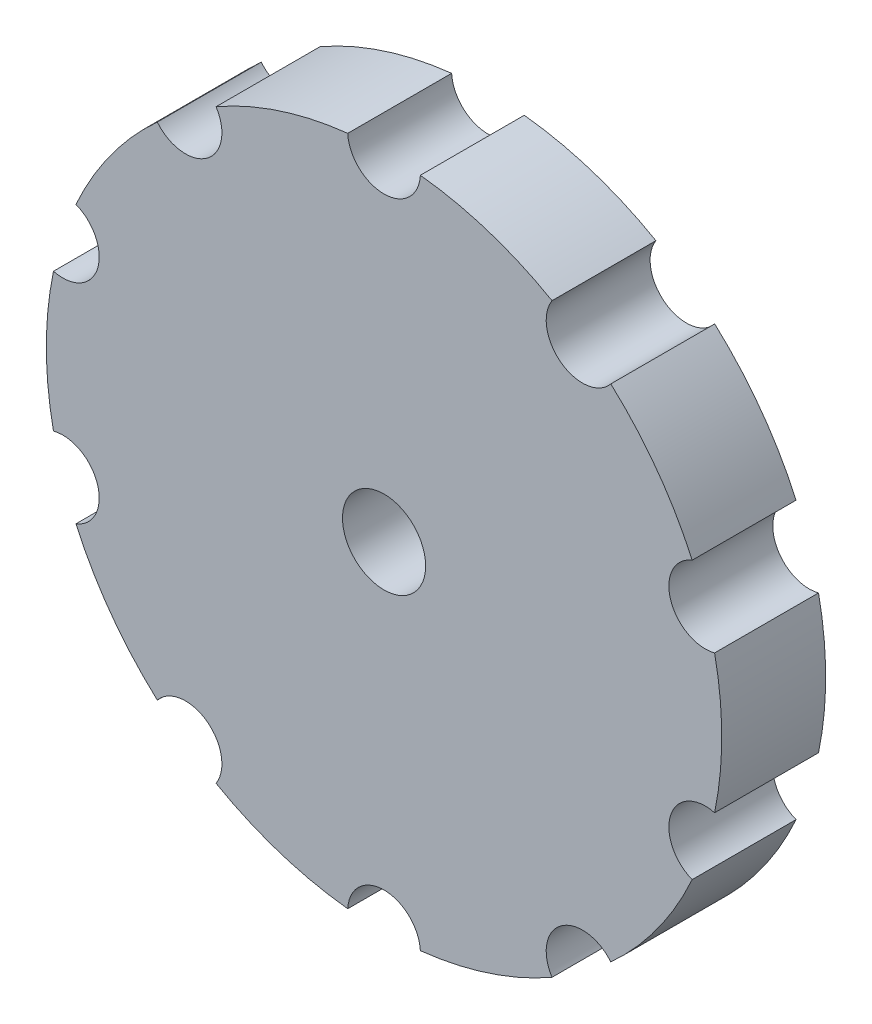
ISO-10303-21;
HEADER;
FILE_DESCRIPTION(('STEP AP214'),'2;1');
FILE_NAME('part.step','',(''),(''),'','','');
FILE_SCHEMA(('AUTOMOTIVE_DESIGN { 1 0 10303 214 1 1 1 1 }'));
ENDSEC;
DATA;
#1=APPLICATION_CONTEXT('core data for automotive mechanical design processes');
#2=APPLICATION_PROTOCOL_DEFINITION('international standard','automotive_design',2000,#1);
#3=PRODUCT_CONTEXT('',#1,'mechanical');
#4=PRODUCT('Part','Part','',(#3));
#5=PRODUCT_RELATED_PRODUCT_CATEGORY('part','',(#4));
#6=PRODUCT_DEFINITION_FORMATION('','',#4);
#7=PRODUCT_DEFINITION_CONTEXT('part definition',#1,'design');
#8=PRODUCT_DEFINITION('design','',#6,#7);
#9=PRODUCT_DEFINITION_SHAPE('','',#8);
#10=(LENGTH_UNIT() NAMED_UNIT(*) SI_UNIT(.MILLI.,.METRE.));
#11=(NAMED_UNIT(*) PLANE_ANGLE_UNIT() SI_UNIT($,.RADIAN.));
#12=(NAMED_UNIT(*) SI_UNIT($,.STERADIAN.) SOLID_ANGLE_UNIT());
#13=UNCERTAINTY_MEASURE_WITH_UNIT(LENGTH_MEASURE(1.E-05),#10,'distance_accuracy_value','');
#14=(GEOMETRIC_REPRESENTATION_CONTEXT(3) GLOBAL_UNCERTAINTY_ASSIGNED_CONTEXT((#13)) GLOBAL_UNIT_ASSIGNED_CONTEXT((#10,
#11,#12)) REPRESENTATION_CONTEXT('',''));
#15=CARTESIAN_POINT('',(0.,0.,0.));
#16=DIRECTION('',(0.,0.,1.));
#17=DIRECTION('',(1.,0.,0.));
#18=AXIS2_PLACEMENT_3D('',#15,#16,#17);
#19=CARTESIAN_POINT('',(-30.9093367795925,-10.0430523171858,10.));
#20=DIRECTION('',(0.,0.,-1.));
#21=DIRECTION('',(-1.,0.,0.));
#22=AXIS2_PLACEMENT_3D('',#19,#20,#21);
#23=CYLINDRICAL_SURFACE('',#22,3.5);
#24=CARTESIAN_POINT('',(-30.9093367795925,-10.0430523171858,0.));
#25=DIRECTION('',(0.,0.,1.));
#26=DIRECTION('',(1.,0.,0.));
#27=AXIS2_PLACEMENT_3D('',#24,#25,#26);
#28=CIRCLE('',#27,3.5);
#29=CARTESIAN_POINT('',(-29.6501088044898,-13.308683176104,0.));
#30=VERTEX_POINT('',#29);
#31=CARTESIAN_POINT('',(-31.8100896062454,-6.66094582192624,0.));
#32=VERTEX_POINT('',#31);
#33=EDGE_CURVE('E202',#30,#32,#28,.T.);
#34=ORIENTED_EDGE('',*,*,#33,.F.);
#35=DIRECTION('',(0.,0.,-1.));
#36=VECTOR('',#35,1.);
#37=CARTESIAN_POINT('',(-29.6501088044898,-13.308683176104,10.));
#38=LINE('',#37,#36);
#39=CARTESIAN_POINT('',(-29.6501088044898,-13.308683176104,10.));
#40=VERTEX_POINT('',#39);
#41=EDGE_CURVE('E11',#40,#30,#38,.T.);
#42=ORIENTED_EDGE('',*,*,#41,.F.);
#43=CARTESIAN_POINT('',(-30.9093367795925,-10.0430523171858,10.));
#44=DIRECTION('',(0.,0.,1.));
#45=DIRECTION('',(1.,0.,0.));
#46=AXIS2_PLACEMENT_3D('',#43,#44,#45);
#47=CIRCLE('',#46,3.5);
#48=CARTESIAN_POINT('',(-31.8100896062454,-6.66094582192624,10.));
#49=VERTEX_POINT('',#48);
#50=EDGE_CURVE('E315',#40,#49,#47,.T.);
#51=ORIENTED_EDGE('',*,*,#50,.T.);
#52=DIRECTION('',(0.,0.,-1.));
#53=VECTOR('',#52,1.);
#54=CARTESIAN_POINT('',(-31.8100896062454,-6.66094582192624,10.));
#55=LINE('',#54,#53);
#56=EDGE_CURVE('E120',#49,#32,#55,.T.);
#57=ORIENTED_EDGE('',*,*,#56,.T.);
#58=EDGE_LOOP('',(#34,#42,#51,#57));
#59=FACE_BOUND('',#58,.T.);
#60=ADVANCED_FACE('F33',(#59),#23,.F.);
#61=CARTESIAN_POINT('',(0.,0.,10.));
#62=DIRECTION('',(0.,0.,-1.));
#63=DIRECTION('',(-1.,0.,0.));
#64=AXIS2_PLACEMENT_3D('',#61,#62,#63);
#65=CYLINDRICAL_SURFACE('',#64,32.5);
#66=CARTESIAN_POINT('',(0.,0.,0.));
#67=DIRECTION('',(0.,0.,1.));
#68=DIRECTION('',(1.,0.,0.));
#69=AXIS2_PLACEMENT_3D('',#66,#67,#68);
#70=CIRCLE('',#69,32.5);
#71=CARTESIAN_POINT('',(-21.819697363595,-24.0863199132023,0.));
#72=VERTEX_POINT('',#71);
#73=EDGE_CURVE('E205',#30,#72,#70,.T.);
#74=ORIENTED_EDGE('',*,*,#73,.T.);
#75=DIRECTION('',(0.,0.,-1.));
#76=VECTOR('',#75,1.);
#77=CARTESIAN_POINT('',(-21.819697363595,-24.0863199132023,10.));
#78=LINE('',#77,#76);
#79=CARTESIAN_POINT('',(-21.819697363595,-24.0863199132023,10.));
#80=VERTEX_POINT('',#79);
#81=EDGE_CURVE('E42',#80,#72,#78,.T.);
#82=ORIENTED_EDGE('',*,*,#81,.F.);
#83=CARTESIAN_POINT('',(0.,0.,10.));
#84=DIRECTION('',(0.,0.,1.));
#85=DIRECTION('',(1.,0.,0.));
#86=AXIS2_PLACEMENT_3D('',#83,#84,#85);
#87=CIRCLE('',#86,32.5);
#88=EDGE_CURVE('E313',#40,#80,#87,.T.);
#89=ORIENTED_EDGE('',*,*,#88,.F.);
#90=ORIENTED_EDGE('',*,*,#41,.T.);
#91=EDGE_LOOP('',(#74,#82,#89,#90));
#92=FACE_BOUND('',#91,.T.);
#93=ADVANCED_FACE('F298',(#92),#65,.T.);
#94=CARTESIAN_POINT('',(-19.1030206995054,-26.2930523171858,10.));
#95=DIRECTION('',(0.,0.,-1.));
#96=DIRECTION('',(-1.,0.,0.));
#97=AXIS2_PLACEMENT_3D('',#94,#95,#96);
#98=CYLINDRICAL_SURFACE('',#97,3.5);
#99=CARTESIAN_POINT('',(-19.1030206995054,-26.2930523171858,0.));
#100=DIRECTION('',(0.,0.,1.));
#101=DIRECTION('',(1.,0.,0.));
#102=AXIS2_PLACEMENT_3D('',#99,#100,#101);
#103=CIRCLE('',#102,3.5);
#104=CARTESIAN_POINT('',(-16.1647942095517,-28.1948475463664,0.));
#105=VERTEX_POINT('',#104);
#106=EDGE_CURVE('E208',#105,#72,#103,.T.);
#107=ORIENTED_EDGE('',*,*,#106,.F.);
#108=DIRECTION('',(0.,0.,-1.));
#109=VECTOR('',#108,1.);
#110=CARTESIAN_POINT('',(-16.1647942095517,-28.1948475463664,10.));
#111=LINE('',#110,#109);
#112=CARTESIAN_POINT('',(-16.1647942095517,-28.1948475463664,10.));
#113=VERTEX_POINT('',#112);
#114=EDGE_CURVE('E288',#113,#105,#111,.T.);
#115=ORIENTED_EDGE('',*,*,#114,.F.);
#116=CARTESIAN_POINT('',(-19.1030206995054,-26.2930523171858,10.));
#117=DIRECTION('',(0.,0.,1.));
#118=DIRECTION('',(1.,0.,0.));
#119=AXIS2_PLACEMENT_3D('',#116,#117,#118);
#120=CIRCLE('',#119,3.5);
#121=EDGE_CURVE('E295',#113,#80,#120,.T.);
#122=ORIENTED_EDGE('',*,*,#121,.T.);
#123=ORIENTED_EDGE('',*,*,#81,.T.);
#124=EDGE_LOOP('',(#107,#115,#122,#123));
#125=FACE_BOUND('',#124,.T.);
#126=ADVANCED_FACE('F293',(#125),#98,.F.);
#127=CARTESIAN_POINT('',(0.,0.,10.));
#128=DIRECTION('',(0.,0.,-1.));
#129=DIRECTION('',(-1.,0.,0.));
#130=AXIS2_PLACEMENT_3D('',#127,#128,#129);
#131=CYLINDRICAL_SURFACE('',#130,32.5);
#132=CARTESIAN_POINT('',(0.,0.,0.));
#133=DIRECTION('',(0.,0.,1.));
#134=DIRECTION('',(1.,0.,0.));
#135=AXIS2_PLACEMENT_3D('',#132,#133,#134);
#136=CIRCLE('',#135,32.5);
#137=CARTESIAN_POINT('',(-3.49492235228777,-32.3115384615385,0.));
#138=VERTEX_POINT('',#137);
#139=EDGE_CURVE('E211',#105,#138,#136,.T.);
#140=ORIENTED_EDGE('',*,*,#139,.T.);
#141=DIRECTION('',(0.,0.,-1.));
#142=VECTOR('',#141,1.);
#143=CARTESIAN_POINT('',(-3.49492235228777,-32.3115384615385,10.));
#144=LINE('',#143,#142);
#145=CARTESIAN_POINT('',(-3.49492235228777,-32.3115384615385,10.));
#146=VERTEX_POINT('',#145);
#147=EDGE_CURVE('E286',#146,#138,#144,.T.);
#148=ORIENTED_EDGE('',*,*,#147,.F.);
#149=CARTESIAN_POINT('',(0.,0.,10.));
#150=DIRECTION('',(0.,0.,1.));
#151=DIRECTION('',(1.,0.,0.));
#152=AXIS2_PLACEMENT_3D('',#149,#150,#151);
#153=CIRCLE('',#152,32.5);
#154=EDGE_CURVE('E309',#113,#146,#153,.T.);
#155=ORIENTED_EDGE('',*,*,#154,.F.);
#156=ORIENTED_EDGE('',*,*,#114,.T.);
#157=EDGE_LOOP('',(#140,#148,#155,#156));
#158=FACE_BOUND('',#157,.T.);
#159=ADVANCED_FACE('F306',(#158),#131,.T.);
#160=CARTESIAN_POINT('',(0.,-32.5,10.));
#161=DIRECTION('',(0.,0.,-1.));
#162=DIRECTION('',(-1.,0.,0.));
#163=AXIS2_PLACEMENT_3D('',#160,#161,#162);
#164=CYLINDRICAL_SURFACE('',#163,3.5);
#165=CARTESIAN_POINT('',(0.,-32.5,0.));
#166=DIRECTION('',(0.,0.,1.));
#167=DIRECTION('',(1.,0.,0.));
#168=AXIS2_PLACEMENT_3D('',#165,#166,#167);
#169=CIRCLE('',#168,3.5);
#170=CARTESIAN_POINT('',(3.49492235228778,-32.3115384615385,0.));
#171=VERTEX_POINT('',#170);
#172=EDGE_CURVE('E214',#171,#138,#169,.T.);
#173=ORIENTED_EDGE('',*,*,#172,.F.);
#174=DIRECTION('',(0.,0.,-1.));
#175=VECTOR('',#174,1.);
#176=CARTESIAN_POINT('',(3.49492235228778,-32.3115384615385,10.));
#177=LINE('',#176,#175);
#178=CARTESIAN_POINT('',(3.49492235228778,-32.3115384615385,10.));
#179=VERTEX_POINT('',#178);
#180=EDGE_CURVE('E284',#179,#171,#177,.T.);
#181=ORIENTED_EDGE('',*,*,#180,.F.);
#182=CARTESIAN_POINT('',(0.,-32.5,10.));
#183=DIRECTION('',(0.,0.,1.));
#184=DIRECTION('',(1.,0.,0.));
#185=AXIS2_PLACEMENT_3D('',#182,#183,#184);
#186=CIRCLE('',#185,3.5);
#187=EDGE_CURVE('E311',#179,#146,#186,.T.);
#188=ORIENTED_EDGE('',*,*,#187,.T.);
#189=ORIENTED_EDGE('',*,*,#147,.T.);
#190=EDGE_LOOP('',(#173,#181,#188,#189));
#191=FACE_BOUND('',#190,.T.);
#192=ADVANCED_FACE('F377',(#191),#164,.F.);
#193=CARTESIAN_POINT('',(0.,0.,10.));
#194=DIRECTION('',(0.,0.,-1.));
#195=DIRECTION('',(-1.,0.,0.));
#196=AXIS2_PLACEMENT_3D('',#193,#194,#195);
#197=CYLINDRICAL_SURFACE('',#196,32.5);
#198=CARTESIAN_POINT('',(0.,0.,0.));
#199=DIRECTION('',(0.,0.,1.));
#200=DIRECTION('',(1.,0.,0.));
#201=AXIS2_PLACEMENT_3D('',#198,#199,#200);
#202=CIRCLE('',#201,32.5);
#203=CARTESIAN_POINT('',(16.1647942095517,-28.1948475463664,0.));
#204=VERTEX_POINT('',#203);
#205=EDGE_CURVE('E217',#171,#204,#202,.T.);
#206=ORIENTED_EDGE('',*,*,#205,.T.);
#207=DIRECTION('',(0.,0.,-1.));
#208=VECTOR('',#207,1.);
#209=CARTESIAN_POINT('',(16.1647942095517,-28.1948475463664,10.));
#210=LINE('',#209,#208);
#211=CARTESIAN_POINT('',(16.1647942095517,-28.1948475463664,10.));
#212=VERTEX_POINT('',#211);
#213=EDGE_CURVE('E282',#212,#204,#210,.T.);
#214=ORIENTED_EDGE('',*,*,#213,.F.);
#215=CARTESIAN_POINT('',(0.,0.,10.));
#216=DIRECTION('',(0.,0.,1.));
#217=DIRECTION('',(1.,0.,0.));
#218=AXIS2_PLACEMENT_3D('',#215,#216,#217);
#219=CIRCLE('',#218,32.5);
#220=EDGE_CURVE('E320',#179,#212,#219,.T.);
#221=ORIENTED_EDGE('',*,*,#220,.F.);
#222=ORIENTED_EDGE('',*,*,#180,.T.);
#223=EDGE_LOOP('',(#206,#214,#221,#222));
#224=FACE_BOUND('',#223,.T.);
#225=ADVANCED_FACE('F380',(#224),#197,.T.);
#226=CARTESIAN_POINT('',(19.1030206995054,-26.2930523171858,10.));
#227=DIRECTION('',(0.,0.,-1.));
#228=DIRECTION('',(-1.,0.,0.));
#229=AXIS2_PLACEMENT_3D('',#226,#227,#228);
#230=CYLINDRICAL_SURFACE('',#229,3.5);
#231=CARTESIAN_POINT('',(19.1030206995054,-26.2930523171858,0.));
#232=DIRECTION('',(0.,0.,1.));
#233=DIRECTION('',(1.,0.,0.));
#234=AXIS2_PLACEMENT_3D('',#231,#232,#233);
#235=CIRCLE('',#234,3.5);
#236=CARTESIAN_POINT('',(21.819697363595,-24.0863199132023,0.));
#237=VERTEX_POINT('',#236);
#238=EDGE_CURVE('E220',#237,#204,#235,.T.);
#239=ORIENTED_EDGE('',*,*,#238,.F.);
#240=DIRECTION('',(0.,0.,-1.));
#241=VECTOR('',#240,1.);
#242=CARTESIAN_POINT('',(21.819697363595,-24.0863199132023,10.));
#243=LINE('',#242,#241);
#244=CARTESIAN_POINT('',(21.819697363595,-24.0863199132023,10.));
#245=VERTEX_POINT('',#244);
#246=EDGE_CURVE('E280',#245,#237,#243,.T.);
#247=ORIENTED_EDGE('',*,*,#246,.F.);
#248=CARTESIAN_POINT('',(19.1030206995054,-26.2930523171858,10.));
#249=DIRECTION('',(0.,0.,1.));
#250=DIRECTION('',(1.,0.,0.));
#251=AXIS2_PLACEMENT_3D('',#248,#249,#250);
#252=CIRCLE('',#251,3.5);
#253=EDGE_CURVE('E322',#245,#212,#252,.T.);
#254=ORIENTED_EDGE('',*,*,#253,.T.);
#255=ORIENTED_EDGE('',*,*,#213,.T.);
#256=EDGE_LOOP('',(#239,#247,#254,#255));
#257=FACE_BOUND('',#256,.T.);
#258=ADVANCED_FACE('F384',(#257),#230,.F.);
#259=CARTESIAN_POINT('',(0.,0.,10.));
#260=DIRECTION('',(0.,0.,-1.));
#261=DIRECTION('',(-1.,0.,0.));
#262=AXIS2_PLACEMENT_3D('',#259,#260,#261);
#263=CYLINDRICAL_SURFACE('',#262,32.5);
#264=CARTESIAN_POINT('',(0.,0.,0.));
#265=DIRECTION('',(0.,0.,1.));
#266=DIRECTION('',(1.,0.,0.));
#267=AXIS2_PLACEMENT_3D('',#264,#265,#266);
#268=CIRCLE('',#267,32.5);
#269=CARTESIAN_POINT('',(29.6501088044898,-13.308683176104,0.));
#270=VERTEX_POINT('',#269);
#271=EDGE_CURVE('E223',#237,#270,#268,.T.);
#272=ORIENTED_EDGE('',*,*,#271,.T.);
#273=DIRECTION('',(0.,0.,-1.));
#274=VECTOR('',#273,1.);
#275=CARTESIAN_POINT('',(29.6501088044898,-13.308683176104,10.));
#276=LINE('',#275,#274);
#277=CARTESIAN_POINT('',(29.6501088044898,-13.308683176104,10.));
#278=VERTEX_POINT('',#277);
#279=EDGE_CURVE('E278',#278,#270,#276,.T.);
#280=ORIENTED_EDGE('',*,*,#279,.F.);
#281=CARTESIAN_POINT('',(0.,0.,10.));
#282=DIRECTION('',(0.,0.,1.));
#283=DIRECTION('',(1.,0.,0.));
#284=AXIS2_PLACEMENT_3D('',#281,#282,#283);
#285=CIRCLE('',#284,32.5);
#286=EDGE_CURVE('E325',#245,#278,#285,.T.);
#287=ORIENTED_EDGE('',*,*,#286,.F.);
#288=ORIENTED_EDGE('',*,*,#246,.T.);
#289=EDGE_LOOP('',(#272,#280,#287,#288));
#290=FACE_BOUND('',#289,.T.);
#291=ADVANCED_FACE('F388',(#290),#263,.T.);
#292=CARTESIAN_POINT('',(30.9093367795925,-10.0430523171858,10.));
#293=DIRECTION('',(0.,0.,-1.));
#294=DIRECTION('',(-1.,0.,0.));
#295=AXIS2_PLACEMENT_3D('',#292,#293,#294);
#296=CYLINDRICAL_SURFACE('',#295,3.5);
#297=CARTESIAN_POINT('',(30.9093367795925,-10.0430523171858,0.));
#298=DIRECTION('',(0.,0.,1.));
#299=DIRECTION('',(1.,0.,0.));
#300=AXIS2_PLACEMENT_3D('',#297,#298,#299);
#301=CIRCLE('',#300,3.5);
#302=CARTESIAN_POINT('',(31.8100896062454,-6.66094582192625,0.));
#303=VERTEX_POINT('',#302);
#304=EDGE_CURVE('E226',#303,#270,#301,.T.);
#305=ORIENTED_EDGE('',*,*,#304,.F.);
#306=DIRECTION('',(0.,0.,-1.));
#307=VECTOR('',#306,1.);
#308=CARTESIAN_POINT('',(31.8100896062454,-6.66094582192625,10.));
#309=LINE('',#308,#307);
#310=CARTESIAN_POINT('',(31.8100896062454,-6.66094582192625,10.));
#311=VERTEX_POINT('',#310);
#312=EDGE_CURVE('E276',#311,#303,#309,.T.);
#313=ORIENTED_EDGE('',*,*,#312,.F.);
#314=CARTESIAN_POINT('',(30.9093367795925,-10.0430523171858,10.));
#315=DIRECTION('',(0.,0.,1.));
#316=DIRECTION('',(1.,0.,0.));
#317=AXIS2_PLACEMENT_3D('',#314,#315,#316);
#318=CIRCLE('',#317,3.5);
#319=EDGE_CURVE('E327',#311,#278,#318,.T.);
#320=ORIENTED_EDGE('',*,*,#319,.T.);
#321=ORIENTED_EDGE('',*,*,#279,.T.);
#322=EDGE_LOOP('',(#305,#313,#320,#321));
#323=FACE_BOUND('',#322,.T.);
#324=ADVANCED_FACE('F392',(#323),#296,.F.);
#325=CARTESIAN_POINT('',(0.,0.,10.));
#326=DIRECTION('',(0.,0.,-1.));
#327=DIRECTION('',(-1.,0.,0.));
#328=AXIS2_PLACEMENT_3D('',#325,#326,#327);
#329=CYLINDRICAL_SURFACE('',#328,32.5);
#330=CARTESIAN_POINT('',(0.,0.,0.));
#331=DIRECTION('',(0.,0.,1.));
#332=DIRECTION('',(1.,0.,0.));
#333=AXIS2_PLACEMENT_3D('',#330,#331,#332);
#334=CIRCLE('',#333,32.5);
#335=CARTESIAN_POINT('',(31.8100896062454,6.66094582192626,0.));
#336=VERTEX_POINT('',#335);
#337=EDGE_CURVE('E229',#303,#336,#334,.T.);
#338=ORIENTED_EDGE('',*,*,#337,.T.);
#339=DIRECTION('',(0.,0.,-1.));
#340=VECTOR('',#339,1.);
#341=CARTESIAN_POINT('',(31.8100896062454,6.66094582192626,10.));
#342=LINE('',#341,#340);
#343=CARTESIAN_POINT('',(31.8100896062454,6.66094582192626,10.));
#344=VERTEX_POINT('',#343);
#345=EDGE_CURVE('E274',#344,#336,#342,.T.);
#346=ORIENTED_EDGE('',*,*,#345,.F.);
#347=CARTESIAN_POINT('',(0.,0.,10.));
#348=DIRECTION('',(0.,0.,1.));
#349=DIRECTION('',(1.,0.,0.));
#350=AXIS2_PLACEMENT_3D('',#347,#348,#349);
#351=CIRCLE('',#350,32.5);
#352=EDGE_CURVE('E330',#311,#344,#351,.T.);
#353=ORIENTED_EDGE('',*,*,#352,.F.);
#354=ORIENTED_EDGE('',*,*,#312,.T.);
#355=EDGE_LOOP('',(#338,#346,#353,#354));
#356=FACE_BOUND('',#355,.T.);
#357=ADVANCED_FACE('F396',(#356),#329,.T.);
#358=CARTESIAN_POINT('',(30.9093367795925,10.0430523171858,10.));
#359=DIRECTION('',(0.,0.,-1.));
#360=DIRECTION('',(-1.,0.,0.));
#361=AXIS2_PLACEMENT_3D('',#358,#359,#360);
#362=CYLINDRICAL_SURFACE('',#361,3.5);
#363=CARTESIAN_POINT('',(30.9093367795925,10.0430523171858,0.));
#364=DIRECTION('',(0.,0.,1.));
#365=DIRECTION('',(1.,0.,0.));
#366=AXIS2_PLACEMENT_3D('',#363,#364,#365);
#367=CIRCLE('',#366,3.5);
#368=CARTESIAN_POINT('',(29.6501088044898,13.308683176104,0.));
#369=VERTEX_POINT('',#368);
#370=EDGE_CURVE('E232',#369,#336,#367,.T.);
#371=ORIENTED_EDGE('',*,*,#370,.F.);
#372=DIRECTION('',(0.,0.,-1.));
#373=VECTOR('',#372,1.);
#374=CARTESIAN_POINT('',(29.6501088044898,13.308683176104,10.));
#375=LINE('',#374,#373);
#376=CARTESIAN_POINT('',(29.6501088044898,13.308683176104,10.));
#377=VERTEX_POINT('',#376);
#378=EDGE_CURVE('E272',#377,#369,#375,.T.);
#379=ORIENTED_EDGE('',*,*,#378,.F.);
#380=CARTESIAN_POINT('',(30.9093367795925,10.0430523171858,10.));
#381=DIRECTION('',(0.,0.,1.));
#382=DIRECTION('',(1.,0.,0.));
#383=AXIS2_PLACEMENT_3D('',#380,#381,#382);
#384=CIRCLE('',#383,3.5);
#385=EDGE_CURVE('E332',#377,#344,#384,.T.);
#386=ORIENTED_EDGE('',*,*,#385,.T.);
#387=ORIENTED_EDGE('',*,*,#345,.T.);
#388=EDGE_LOOP('',(#371,#379,#386,#387));
#389=FACE_BOUND('',#388,.T.);
#390=ADVANCED_FACE('F400',(#389),#362,.F.);
#391=CARTESIAN_POINT('',(0.,0.,10.));
#392=DIRECTION('',(0.,0.,-1.));
#393=DIRECTION('',(-1.,0.,0.));
#394=AXIS2_PLACEMENT_3D('',#391,#392,#393);
#395=CYLINDRICAL_SURFACE('',#394,32.5);
#396=CARTESIAN_POINT('',(0.,0.,0.));
#397=DIRECTION('',(0.,0.,1.));
#398=DIRECTION('',(1.,0.,0.));
#399=AXIS2_PLACEMENT_3D('',#396,#397,#398);
#400=CIRCLE('',#399,32.5);
#401=CARTESIAN_POINT('',(21.819697363595,24.0863199132023,0.));
#402=VERTEX_POINT('',#401);
#403=EDGE_CURVE('E235',#369,#402,#400,.T.);
#404=ORIENTED_EDGE('',*,*,#403,.T.);
#405=DIRECTION('',(0.,0.,-1.));
#406=VECTOR('',#405,1.);
#407=CARTESIAN_POINT('',(21.819697363595,24.0863199132023,10.));
#408=LINE('',#407,#406);
#409=CARTESIAN_POINT('',(21.819697363595,24.0863199132023,10.));
#410=VERTEX_POINT('',#409);
#411=EDGE_CURVE('E270',#410,#402,#408,.T.);
#412=ORIENTED_EDGE('',*,*,#411,.F.);
#413=CARTESIAN_POINT('',(0.,0.,10.));
#414=DIRECTION('',(0.,0.,1.));
#415=DIRECTION('',(1.,0.,0.));
#416=AXIS2_PLACEMENT_3D('',#413,#414,#415);
#417=CIRCLE('',#416,32.5);
#418=EDGE_CURVE('E335',#377,#410,#417,.T.);
#419=ORIENTED_EDGE('',*,*,#418,.F.);
#420=ORIENTED_EDGE('',*,*,#378,.T.);
#421=EDGE_LOOP('',(#404,#412,#419,#420));
#422=FACE_BOUND('',#421,.T.);
#423=ADVANCED_FACE('F404',(#422),#395,.T.);
#424=CARTESIAN_POINT('',(19.1030206995054,26.2930523171858,10.));
#425=DIRECTION('',(0.,0.,-1.));
#426=DIRECTION('',(-1.,0.,0.));
#427=AXIS2_PLACEMENT_3D('',#424,#425,#426);
#428=CYLINDRICAL_SURFACE('',#427,3.5);
#429=CARTESIAN_POINT('',(19.1030206995054,26.2930523171858,0.));
#430=DIRECTION('',(0.,0.,1.));
#431=DIRECTION('',(1.,0.,0.));
#432=AXIS2_PLACEMENT_3D('',#429,#430,#431);
#433=CIRCLE('',#432,3.5);
#434=CARTESIAN_POINT('',(16.1647942095517,28.1948475463664,0.));
#435=VERTEX_POINT('',#434);
#436=EDGE_CURVE('E238',#435,#402,#433,.T.);
#437=ORIENTED_EDGE('',*,*,#436,.F.);
#438=DIRECTION('',(0.,0.,-1.));
#439=VECTOR('',#438,1.);
#440=CARTESIAN_POINT('',(16.1647942095517,28.1948475463664,10.));
#441=LINE('',#440,#439);
#442=CARTESIAN_POINT('',(16.1647942095517,28.1948475463664,10.));
#443=VERTEX_POINT('',#442);
#444=EDGE_CURVE('E268',#443,#435,#441,.T.);
#445=ORIENTED_EDGE('',*,*,#444,.F.);
#446=CARTESIAN_POINT('',(19.1030206995054,26.2930523171858,10.));
#447=DIRECTION('',(0.,0.,1.));
#448=DIRECTION('',(1.,0.,0.));
#449=AXIS2_PLACEMENT_3D('',#446,#447,#448);
#450=CIRCLE('',#449,3.5);
#451=EDGE_CURVE('E337',#443,#410,#450,.T.);
#452=ORIENTED_EDGE('',*,*,#451,.T.);
#453=ORIENTED_EDGE('',*,*,#411,.T.);
#454=EDGE_LOOP('',(#437,#445,#452,#453));
#455=FACE_BOUND('',#454,.T.);
#456=ADVANCED_FACE('F408',(#455),#428,.F.);
#457=CARTESIAN_POINT('',(0.,0.,10.));
#458=DIRECTION('',(0.,0.,-1.));
#459=DIRECTION('',(-1.,0.,0.));
#460=AXIS2_PLACEMENT_3D('',#457,#458,#459);
#461=CYLINDRICAL_SURFACE('',#460,32.5);
#462=CARTESIAN_POINT('',(0.,0.,0.));
#463=DIRECTION('',(0.,0.,1.));
#464=DIRECTION('',(1.,0.,0.));
#465=AXIS2_PLACEMENT_3D('',#462,#463,#464);
#466=CIRCLE('',#465,32.5);
#467=CARTESIAN_POINT('',(3.49492235228778,32.3115384615385,0.));
#468=VERTEX_POINT('',#467);
#469=EDGE_CURVE('E241',#435,#468,#466,.T.);
#470=ORIENTED_EDGE('',*,*,#469,.T.);
#471=DIRECTION('',(0.,0.,-1.));
#472=VECTOR('',#471,1.);
#473=CARTESIAN_POINT('',(3.49492235228778,32.3115384615385,10.));
#474=LINE('',#473,#472);
#475=CARTESIAN_POINT('',(3.49492235228778,32.3115384615385,10.));
#476=VERTEX_POINT('',#475);
#477=EDGE_CURVE('E266',#476,#468,#474,.T.);
#478=ORIENTED_EDGE('',*,*,#477,.F.);
#479=CARTESIAN_POINT('',(0.,0.,10.));
#480=DIRECTION('',(0.,0.,1.));
#481=DIRECTION('',(1.,0.,0.));
#482=AXIS2_PLACEMENT_3D('',#479,#480,#481);
#483=CIRCLE('',#482,32.5);
#484=EDGE_CURVE('E340',#443,#476,#483,.T.);
#485=ORIENTED_EDGE('',*,*,#484,.F.);
#486=ORIENTED_EDGE('',*,*,#444,.T.);
#487=EDGE_LOOP('',(#470,#478,#485,#486));
#488=FACE_BOUND('',#487,.T.);
#489=ADVANCED_FACE('F412',(#488),#461,.T.);
#490=CARTESIAN_POINT('',(0.,32.5,10.));
#491=DIRECTION('',(0.,0.,-1.));
#492=DIRECTION('',(-1.,0.,0.));
#493=AXIS2_PLACEMENT_3D('',#490,#491,#492);
#494=CYLINDRICAL_SURFACE('',#493,3.5);
#495=CARTESIAN_POINT('',(0.,32.5,0.));
#496=DIRECTION('',(0.,0.,1.));
#497=DIRECTION('',(1.,0.,0.));
#498=AXIS2_PLACEMENT_3D('',#495,#496,#497);
#499=CIRCLE('',#498,3.5);
#500=CARTESIAN_POINT('',(-3.49492235228778,32.3115384615385,0.));
#501=VERTEX_POINT('',#500);
#502=EDGE_CURVE('E244',#501,#468,#499,.T.);
#503=ORIENTED_EDGE('',*,*,#502,.F.);
#504=DIRECTION('',(0.,0.,-1.));
#505=VECTOR('',#504,1.);
#506=CARTESIAN_POINT('',(-3.49492235228778,32.3115384615385,10.));
#507=LINE('',#506,#505);
#508=CARTESIAN_POINT('',(-3.49492235228778,32.3115384615385,10.));
#509=VERTEX_POINT('',#508);
#510=EDGE_CURVE('E264',#509,#501,#507,.T.);
#511=ORIENTED_EDGE('',*,*,#510,.F.);
#512=CARTESIAN_POINT('',(0.,32.5,10.));
#513=DIRECTION('',(0.,0.,1.));
#514=DIRECTION('',(1.,0.,0.));
#515=AXIS2_PLACEMENT_3D('',#512,#513,#514);
#516=CIRCLE('',#515,3.5);
#517=EDGE_CURVE('E342',#509,#476,#516,.T.);
#518=ORIENTED_EDGE('',*,*,#517,.T.);
#519=ORIENTED_EDGE('',*,*,#477,.T.);
#520=EDGE_LOOP('',(#503,#511,#518,#519));
#521=FACE_BOUND('',#520,.T.);
#522=ADVANCED_FACE('F416',(#521),#494,.F.);
#523=CARTESIAN_POINT('',(0.,0.,10.));
#524=DIRECTION('',(0.,0.,-1.));
#525=DIRECTION('',(-1.,0.,0.));
#526=AXIS2_PLACEMENT_3D('',#523,#524,#525);
#527=CYLINDRICAL_SURFACE('',#526,32.5);
#528=CARTESIAN_POINT('',(0.,0.,0.));
#529=DIRECTION('',(0.,0.,1.));
#530=DIRECTION('',(1.,0.,0.));
#531=AXIS2_PLACEMENT_3D('',#528,#529,#530);
#532=CIRCLE('',#531,32.5);
#533=CARTESIAN_POINT('',(-16.1647942095517,28.1948475463664,0.));
#534=VERTEX_POINT('',#533);
#535=EDGE_CURVE('E247',#501,#534,#532,.T.);
#536=ORIENTED_EDGE('',*,*,#535,.T.);
#537=DIRECTION('',(0.,0.,-1.));
#538=VECTOR('',#537,1.);
#539=CARTESIAN_POINT('',(-16.1647942095517,28.1948475463664,10.));
#540=LINE('',#539,#538);
#541=CARTESIAN_POINT('',(-16.1647942095517,28.1948475463664,10.));
#542=VERTEX_POINT('',#541);
#543=EDGE_CURVE('E262',#542,#534,#540,.T.);
#544=ORIENTED_EDGE('',*,*,#543,.F.);
#545=CARTESIAN_POINT('',(0.,0.,10.));
#546=DIRECTION('',(0.,0.,1.));
#547=DIRECTION('',(1.,0.,0.));
#548=AXIS2_PLACEMENT_3D('',#545,#546,#547);
#549=CIRCLE('',#548,32.5);
#550=EDGE_CURVE('E345',#509,#542,#549,.T.);
#551=ORIENTED_EDGE('',*,*,#550,.F.);
#552=ORIENTED_EDGE('',*,*,#510,.T.);
#553=EDGE_LOOP('',(#536,#544,#551,#552));
#554=FACE_BOUND('',#553,.T.);
#555=ADVANCED_FACE('F420',(#554),#527,.T.);
#556=CARTESIAN_POINT('',(-19.1030206995054,26.2930523171858,10.));
#557=DIRECTION('',(0.,0.,-1.));
#558=DIRECTION('',(-1.,0.,0.));
#559=AXIS2_PLACEMENT_3D('',#556,#557,#558);
#560=CYLINDRICAL_SURFACE('',#559,3.5);
#561=CARTESIAN_POINT('',(-19.1030206995054,26.2930523171858,0.));
#562=DIRECTION('',(0.,0.,1.));
#563=DIRECTION('',(1.,0.,0.));
#564=AXIS2_PLACEMENT_3D('',#561,#562,#563);
#565=CIRCLE('',#564,3.5);
#566=CARTESIAN_POINT('',(-21.819697363595,24.0863199132023,0.));
#567=VERTEX_POINT('',#566);
#568=EDGE_CURVE('E250',#567,#534,#565,.T.);
#569=ORIENTED_EDGE('',*,*,#568,.F.);
#570=DIRECTION('',(0.,0.,-1.));
#571=VECTOR('',#570,1.);
#572=CARTESIAN_POINT('',(-21.819697363595,24.0863199132023,10.));
#573=LINE('',#572,#571);
#574=CARTESIAN_POINT('',(-21.819697363595,24.0863199132023,10.));
#575=VERTEX_POINT('',#574);
#576=EDGE_CURVE('E192',#575,#567,#573,.T.);
#577=ORIENTED_EDGE('',*,*,#576,.F.);
#578=CARTESIAN_POINT('',(-19.1030206995054,26.2930523171858,10.));
#579=DIRECTION('',(0.,0.,1.));
#580=DIRECTION('',(1.,0.,0.));
#581=AXIS2_PLACEMENT_3D('',#578,#579,#580);
#582=CIRCLE('',#581,3.5);
#583=EDGE_CURVE('E181',#575,#542,#582,.T.);
#584=ORIENTED_EDGE('',*,*,#583,.T.);
#585=ORIENTED_EDGE('',*,*,#543,.T.);
#586=EDGE_LOOP('',(#569,#577,#584,#585));
#587=FACE_BOUND('',#586,.T.);
#588=ADVANCED_FACE('F348',(#587),#560,.F.);
#589=CARTESIAN_POINT('',(0.,0.,10.));
#590=DIRECTION('',(0.,0.,-1.));
#591=DIRECTION('',(-1.,0.,0.));
#592=AXIS2_PLACEMENT_3D('',#589,#590,#591);
#593=CYLINDRICAL_SURFACE('',#592,32.5);
#594=CARTESIAN_POINT('',(0.,0.,0.));
#595=DIRECTION('',(0.,0.,1.));
#596=DIRECTION('',(1.,0.,0.));
#597=AXIS2_PLACEMENT_3D('',#594,#595,#596);
#598=CIRCLE('',#597,32.5);
#599=CARTESIAN_POINT('',(-29.6501088044898,13.308683176104,0.));
#600=VERTEX_POINT('',#599);
#601=EDGE_CURVE('E188',#567,#600,#598,.T.);
#602=ORIENTED_EDGE('',*,*,#601,.T.);
#603=DIRECTION('',(0.,0.,-1.));
#604=VECTOR('',#603,1.);
#605=CARTESIAN_POINT('',(-29.6501088044898,13.308683176104,10.));
#606=LINE('',#605,#604);
#607=CARTESIAN_POINT('',(-29.6501088044898,13.308683176104,10.));
#608=VERTEX_POINT('',#607);
#609=EDGE_CURVE('E185',#608,#600,#606,.T.);
#610=ORIENTED_EDGE('',*,*,#609,.F.);
#611=CARTESIAN_POINT('',(0.,0.,10.));
#612=DIRECTION('',(0.,0.,1.));
#613=DIRECTION('',(1.,0.,0.));
#614=AXIS2_PLACEMENT_3D('',#611,#612,#613);
#615=CIRCLE('',#614,32.5);
#616=EDGE_CURVE('E175',#575,#608,#615,.T.);
#617=ORIENTED_EDGE('',*,*,#616,.F.);
#618=ORIENTED_EDGE('',*,*,#576,.T.);
#619=EDGE_LOOP('',(#602,#610,#617,#618));
#620=FACE_BOUND('',#619,.T.);
#621=ADVANCED_FACE('F186',(#620),#593,.T.);
#622=CARTESIAN_POINT('',(-30.9093367795925,10.0430523171858,10.));
#623=DIRECTION('',(0.,0.,-1.));
#624=DIRECTION('',(-1.,0.,0.));
#625=AXIS2_PLACEMENT_3D('',#622,#623,#624);
#626=CYLINDRICAL_SURFACE('',#625,3.5);
#627=CARTESIAN_POINT('',(-30.9093367795925,10.0430523171858,0.));
#628=DIRECTION('',(0.,0.,1.));
#629=DIRECTION('',(1.,0.,0.));
#630=AXIS2_PLACEMENT_3D('',#627,#628,#629);
#631=CIRCLE('',#630,3.5);
#632=CARTESIAN_POINT('',(-31.8100896062454,6.66094582192625,0.));
#633=VERTEX_POINT('',#632);
#634=EDGE_CURVE('E254',#633,#600,#631,.T.);
#635=ORIENTED_EDGE('',*,*,#634,.F.);
#636=DIRECTION('',(0.,0.,-1.));
#637=VECTOR('',#636,1.);
#638=CARTESIAN_POINT('',(-31.8100896062454,6.66094582192625,10.));
#639=LINE('',#638,#637);
#640=CARTESIAN_POINT('',(-31.8100896062454,6.66094582192625,10.));
#641=VERTEX_POINT('',#640);
#642=EDGE_CURVE('E113',#641,#633,#639,.T.);
#643=ORIENTED_EDGE('',*,*,#642,.F.);
#644=CARTESIAN_POINT('',(-30.9093367795925,10.0430523171858,10.));
#645=DIRECTION('',(0.,0.,1.));
#646=DIRECTION('',(1.,0.,0.));
#647=AXIS2_PLACEMENT_3D('',#644,#645,#646);
#648=CIRCLE('',#647,3.5);
#649=EDGE_CURVE('E179',#641,#608,#648,.T.);
#650=ORIENTED_EDGE('',*,*,#649,.T.);
#651=ORIENTED_EDGE('',*,*,#609,.T.);
#652=EDGE_LOOP('',(#635,#643,#650,#651));
#653=FACE_BOUND('',#652,.T.);
#654=ADVANCED_FACE('F194',(#653),#626,.F.);
#655=CARTESIAN_POINT('',(0.,0.,10.));
#656=DIRECTION('',(0.,0.,-1.));
#657=DIRECTION('',(-1.,0.,0.));
#658=AXIS2_PLACEMENT_3D('',#655,#656,#657);
#659=CYLINDRICAL_SURFACE('',#658,4.);
#660=CARTESIAN_POINT('',(0.,0.,10.));
#661=DIRECTION('',(0.,0.,1.));
#662=DIRECTION('',(1.,0.,0.));
#663=AXIS2_PLACEMENT_3D('',#660,#661,#662);
#664=CIRCLE('',#663,4.);
#665=CARTESIAN_POINT('',(4.,0.,10.));
#666=VERTEX_POINT('',#665);
#667=EDGE_CURVE('E258',#666,#666,#664,.T.);
#668=ORIENTED_EDGE('',*,*,#667,.T.);
#669=EDGE_LOOP('',(#668));
#670=FACE_BOUND('',#669,.T.);
#671=CARTESIAN_POINT('',(0.,0.,0.));
#672=DIRECTION('',(0.,0.,1.));
#673=DIRECTION('',(1.,0.,0.));
#674=AXIS2_PLACEMENT_3D('',#671,#672,#673);
#675=CIRCLE('',#674,4.);
#676=CARTESIAN_POINT('',(4.,0.,0.));
#677=VERTEX_POINT('',#676);
#678=EDGE_CURVE('E199',#677,#677,#675,.T.);
#679=ORIENTED_EDGE('',*,*,#678,.F.);
#680=EDGE_LOOP('',(#679));
#681=FACE_BOUND('',#680,.T.);
#682=ADVANCED_FACE('F35',(#670,#681),#659,.F.);
#683=CARTESIAN_POINT('',(0.,0.,10.));
#684=DIRECTION('',(0.,0.,-1.));
#685=DIRECTION('',(-1.,0.,0.));
#686=AXIS2_PLACEMENT_3D('',#683,#684,#685);
#687=CYLINDRICAL_SURFACE('',#686,32.5);
#688=CARTESIAN_POINT('',(0.,0.,0.));
#689=DIRECTION('',(0.,0.,1.));
#690=DIRECTION('',(1.,0.,0.));
#691=AXIS2_PLACEMENT_3D('',#688,#689,#690);
#692=CIRCLE('',#691,32.5);
#693=EDGE_CURVE('E256',#633,#32,#692,.T.);
#694=ORIENTED_EDGE('',*,*,#693,.T.);
#695=ORIENTED_EDGE('',*,*,#56,.F.);
#696=CARTESIAN_POINT('',(0.,0.,10.));
#697=DIRECTION('',(0.,0.,1.));
#698=DIRECTION('',(1.,0.,0.));
#699=AXIS2_PLACEMENT_3D('',#696,#697,#698);
#700=CIRCLE('',#699,32.5);
#701=EDGE_CURVE('E50',#641,#49,#700,.T.);
#702=ORIENTED_EDGE('',*,*,#701,.F.);
#703=ORIENTED_EDGE('',*,*,#642,.T.);
#704=EDGE_LOOP('',(#694,#695,#702,#703));
#705=FACE_BOUND('',#704,.T.);
#706=ADVANCED_FACE('F351',(#705),#687,.T.);
#707=CARTESIAN_POINT('',(0.,0.,10.));
#708=DIRECTION('',(0.,0.,1.));
#709=DIRECTION('',(1.,0.,0.));
#710=AXIS2_PLACEMENT_3D('',#707,#708,#709);
#711=PLANE('',#710);
#712=ORIENTED_EDGE('',*,*,#667,.F.);
#713=EDGE_LOOP('',(#712));
#714=FACE_BOUND('',#713,.T.);
#715=ORIENTED_EDGE('',*,*,#50,.F.);
#716=ORIENTED_EDGE('',*,*,#88,.T.);
#717=ORIENTED_EDGE('',*,*,#121,.F.);
#718=ORIENTED_EDGE('',*,*,#154,.T.);
#719=ORIENTED_EDGE('',*,*,#187,.F.);
#720=ORIENTED_EDGE('',*,*,#220,.T.);
#721=ORIENTED_EDGE('',*,*,#253,.F.);
#722=ORIENTED_EDGE('',*,*,#286,.T.);
#723=ORIENTED_EDGE('',*,*,#319,.F.);
#724=ORIENTED_EDGE('',*,*,#352,.T.);
#725=ORIENTED_EDGE('',*,*,#385,.F.);
#726=ORIENTED_EDGE('',*,*,#418,.T.);
#727=ORIENTED_EDGE('',*,*,#451,.F.);
#728=ORIENTED_EDGE('',*,*,#484,.T.);
#729=ORIENTED_EDGE('',*,*,#517,.F.);
#730=ORIENTED_EDGE('',*,*,#550,.T.);
#731=ORIENTED_EDGE('',*,*,#583,.F.);
#732=ORIENTED_EDGE('',*,*,#616,.T.);
#733=ORIENTED_EDGE('',*,*,#649,.F.);
#734=ORIENTED_EDGE('',*,*,#701,.T.);
#735=EDGE_LOOP('',(#715,#716,#717,#718,#719,#720,#721,#722,#723,#724,#725,#726,#727,#728,#729,
#730,#731,#732,#733,#734));
#736=FACE_BOUND('',#735,.T.);
#737=ADVANCED_FACE('F177',(#714,#736),#711,.T.);
#738=CARTESIAN_POINT('',(0.,0.,0.));
#739=DIRECTION('',(0.,0.,1.));
#740=DIRECTION('',(1.,0.,0.));
#741=AXIS2_PLACEMENT_3D('',#738,#739,#740);
#742=PLANE('',#741);
#743=ORIENTED_EDGE('',*,*,#678,.T.);
#744=EDGE_LOOP('',(#743));
#745=FACE_BOUND('',#744,.T.);
#746=ORIENTED_EDGE('',*,*,#33,.T.);
#747=ORIENTED_EDGE('',*,*,#693,.F.);
#748=ORIENTED_EDGE('',*,*,#634,.T.);
#749=ORIENTED_EDGE('',*,*,#601,.F.);
#750=ORIENTED_EDGE('',*,*,#568,.T.);
#751=ORIENTED_EDGE('',*,*,#535,.F.);
#752=ORIENTED_EDGE('',*,*,#502,.T.);
#753=ORIENTED_EDGE('',*,*,#469,.F.);
#754=ORIENTED_EDGE('',*,*,#436,.T.);
#755=ORIENTED_EDGE('',*,*,#403,.F.);
#756=ORIENTED_EDGE('',*,*,#370,.T.);
#757=ORIENTED_EDGE('',*,*,#337,.F.);
#758=ORIENTED_EDGE('',*,*,#304,.T.);
#759=ORIENTED_EDGE('',*,*,#271,.F.);
#760=ORIENTED_EDGE('',*,*,#238,.T.);
#761=ORIENTED_EDGE('',*,*,#205,.F.);
#762=ORIENTED_EDGE('',*,*,#172,.T.);
#763=ORIENTED_EDGE('',*,*,#139,.F.);
#764=ORIENTED_EDGE('',*,*,#106,.T.);
#765=ORIENTED_EDGE('',*,*,#73,.F.);
#766=EDGE_LOOP('',(#746,#747,#748,#749,#750,#751,#752,#753,#754,#755,#756,#757,#758,#759,#760,
#761,#762,#763,#764,#765));
#767=FACE_BOUND('',#766,.T.);
#768=ADVANCED_FACE('F301',(#745,#767),#742,.F.);
#769=CLOSED_SHELL('',(#60,#93,#126,#159,#192,#225,#258,#291,#324,#357,#390,#423,#456,#489,#522,
#555,#588,#621,#654,#682,#706,#737,#768));
#770=MANIFOLD_SOLID_BREP('B2',#769);
#771=ADVANCED_BREP_SHAPE_REPRESENTATION('',(#18,#770),#14);
#772=SHAPE_DEFINITION_REPRESENTATION(#9,#771);
ENDSEC;
END-ISO-10303-21;
